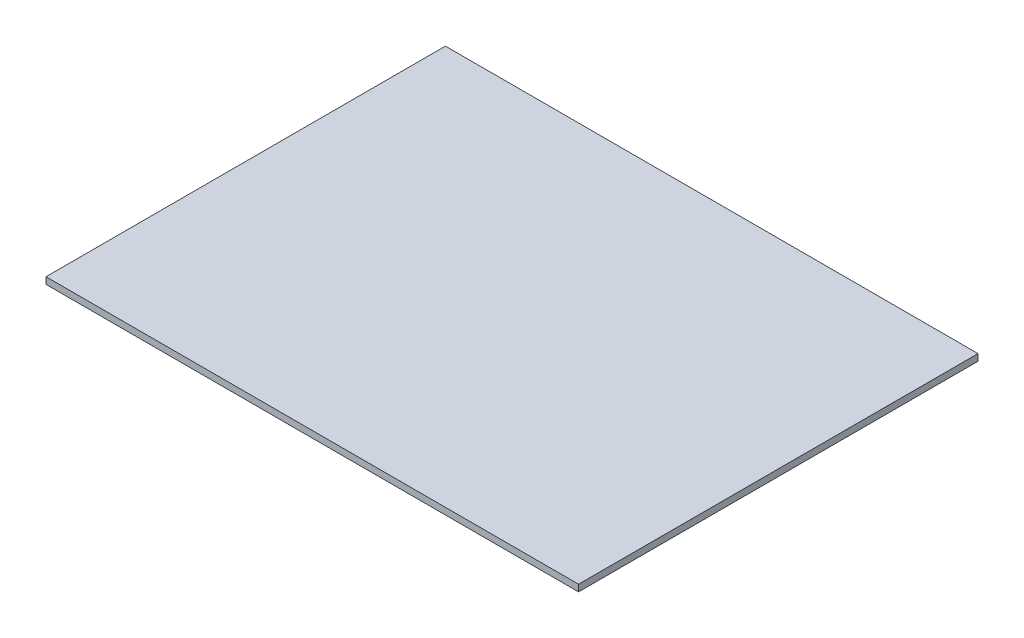
ISO-10303-21;
HEADER;
FILE_DESCRIPTION(('STEP AP214'),'2;1');
FILE_NAME('part.step','',(''),(''),'','','');
FILE_SCHEMA(('AUTOMOTIVE_DESIGN { 1 0 10303 214 1 1 1 1 }'));
ENDSEC;
DATA;
#1=APPLICATION_CONTEXT('core data for automotive mechanical design processes');
#2=APPLICATION_PROTOCOL_DEFINITION('international standard','automotive_design',2000,#1);
#3=PRODUCT_CONTEXT('',#1,'mechanical');
#4=PRODUCT('Part','Part','',(#3));
#5=PRODUCT_RELATED_PRODUCT_CATEGORY('part','',(#4));
#6=PRODUCT_DEFINITION_FORMATION('','',#4);
#7=PRODUCT_DEFINITION_CONTEXT('part definition',#1,'design');
#8=PRODUCT_DEFINITION('design','',#6,#7);
#9=PRODUCT_DEFINITION_SHAPE('','',#8);
#10=(LENGTH_UNIT() NAMED_UNIT(*) SI_UNIT(.MILLI.,.METRE.));
#11=(NAMED_UNIT(*) PLANE_ANGLE_UNIT() SI_UNIT($,.RADIAN.));
#12=(NAMED_UNIT(*) SI_UNIT($,.STERADIAN.) SOLID_ANGLE_UNIT());
#13=UNCERTAINTY_MEASURE_WITH_UNIT(LENGTH_MEASURE(1.E-05),#10,'distance_accuracy_value','');
#14=(GEOMETRIC_REPRESENTATION_CONTEXT(3) GLOBAL_UNCERTAINTY_ASSIGNED_CONTEXT((#13)) GLOBAL_UNIT_ASSIGNED_CONTEXT((#10,
#11,#12)) REPRESENTATION_CONTEXT('',''));
#15=CARTESIAN_POINT('',(0.,0.,0.));
#16=DIRECTION('',(0.,0.,1.));
#17=DIRECTION('',(1.,0.,0.));
#18=AXIS2_PLACEMENT_3D('',#15,#16,#17);
#19=CARTESIAN_POINT('',(127.,3.175,-95.25));
#20=DIRECTION('',(-1.,0.,0.));
#21=DIRECTION('',(0.,0.,1.));
#22=AXIS2_PLACEMENT_3D('',#19,#20,#21);
#23=PLANE('',#22);
#24=DIRECTION('',(0.,0.,-1.));
#25=VECTOR('',#24,1.);
#26=CARTESIAN_POINT('',(127.,0.,-95.25));
#27=LINE('',#26,#25);
#28=CARTESIAN_POINT('',(127.,0.,95.25));
#29=VERTEX_POINT('',#28);
#30=CARTESIAN_POINT('',(127.,0.,-95.25));
#31=VERTEX_POINT('',#30);
#32=EDGE_CURVE('E101',#29,#31,#27,.T.);
#33=ORIENTED_EDGE('',*,*,#32,.T.);
#34=DIRECTION('',(0.,-1.,0.));
#35=VECTOR('',#34,1.);
#36=CARTESIAN_POINT('',(127.,3.175,-95.25));
#37=LINE('',#36,#35);
#38=CARTESIAN_POINT('',(127.,3.175,-95.25));
#39=VERTEX_POINT('',#38);
#40=EDGE_CURVE('E11',#39,#31,#37,.T.);
#41=ORIENTED_EDGE('',*,*,#40,.F.);
#42=DIRECTION('',(0.,0.,-1.));
#43=VECTOR('',#42,1.);
#44=CARTESIAN_POINT('',(127.,3.175,-95.25));
#45=LINE('',#44,#43);
#46=CARTESIAN_POINT('',(127.,3.175,95.25));
#47=VERTEX_POINT('',#46);
#48=EDGE_CURVE('E89',#47,#39,#45,.T.);
#49=ORIENTED_EDGE('',*,*,#48,.F.);
#50=DIRECTION('',(0.,-1.,0.));
#51=VECTOR('',#50,1.);
#52=CARTESIAN_POINT('',(127.,3.175,95.25));
#53=LINE('',#52,#51);
#54=EDGE_CURVE('E97',#47,#29,#53,.T.);
#55=ORIENTED_EDGE('',*,*,#54,.T.);
#56=EDGE_LOOP('',(#33,#41,#49,#55));
#57=FACE_BOUND('',#56,.T.);
#58=ADVANCED_FACE('F38',(#57),#23,.F.);
#59=CARTESIAN_POINT('',(-127.,3.175,-95.25));
#60=DIRECTION('',(0.,0.,1.));
#61=DIRECTION('',(1.,0.,0.));
#62=AXIS2_PLACEMENT_3D('',#59,#60,#61);
#63=PLANE('',#62);
#64=DIRECTION('',(-1.,0.,0.));
#65=VECTOR('',#64,1.);
#66=CARTESIAN_POINT('',(-127.,0.,-95.25));
#67=LINE('',#66,#65);
#68=CARTESIAN_POINT('',(-127.,0.,-95.25));
#69=VERTEX_POINT('',#68);
#70=EDGE_CURVE('E93',#31,#69,#67,.T.);
#71=ORIENTED_EDGE('',*,*,#70,.T.);
#72=DIRECTION('',(0.,-1.,0.));
#73=VECTOR('',#72,1.);
#74=CARTESIAN_POINT('',(-127.,3.175,-95.25));
#75=LINE('',#74,#73);
#76=CARTESIAN_POINT('',(-127.,3.175,-95.25));
#77=VERTEX_POINT('',#76);
#78=EDGE_CURVE('E46',#77,#69,#75,.T.);
#79=ORIENTED_EDGE('',*,*,#78,.F.);
#80=DIRECTION('',(-1.,0.,0.));
#81=VECTOR('',#80,1.);
#82=CARTESIAN_POINT('',(-127.,3.175,-95.25));
#83=LINE('',#82,#81);
#84=EDGE_CURVE('E84',#39,#77,#83,.T.);
#85=ORIENTED_EDGE('',*,*,#84,.F.);
#86=ORIENTED_EDGE('',*,*,#40,.T.);
#87=EDGE_LOOP('',(#71,#79,#85,#86));
#88=FACE_BOUND('',#87,.T.);
#89=ADVANCED_FACE('F92',(#88),#63,.F.);
#90=CARTESIAN_POINT('',(-127.,3.175,-95.25));
#91=DIRECTION('',(1.,0.,0.));
#92=DIRECTION('',(0.,0.,-1.));
#93=AXIS2_PLACEMENT_3D('',#90,#91,#92);
#94=PLANE('',#93);
#95=DIRECTION('',(0.,0.,1.));
#96=VECTOR('',#95,1.);
#97=CARTESIAN_POINT('',(-127.,0.,-95.25));
#98=LINE('',#97,#96);
#99=CARTESIAN_POINT('',(-127.,0.,95.25));
#100=VERTEX_POINT('',#99);
#101=EDGE_CURVE('E71',#69,#100,#98,.T.);
#102=ORIENTED_EDGE('',*,*,#101,.T.);
#103=DIRECTION('',(0.,-1.,0.));
#104=VECTOR('',#103,1.);
#105=CARTESIAN_POINT('',(-127.,3.175,95.25));
#106=LINE('',#105,#104);
#107=CARTESIAN_POINT('',(-127.,3.175,95.25));
#108=VERTEX_POINT('',#107);
#109=EDGE_CURVE('E94',#108,#100,#106,.T.);
#110=ORIENTED_EDGE('',*,*,#109,.F.);
#111=DIRECTION('',(0.,0.,1.));
#112=VECTOR('',#111,1.);
#113=CARTESIAN_POINT('',(-127.,3.175,-95.25));
#114=LINE('',#113,#112);
#115=EDGE_CURVE('E87',#77,#108,#114,.T.);
#116=ORIENTED_EDGE('',*,*,#115,.F.);
#117=ORIENTED_EDGE('',*,*,#78,.T.);
#118=EDGE_LOOP('',(#102,#110,#116,#117));
#119=FACE_BOUND('',#118,.T.);
#120=ADVANCED_FACE('F95',(#119),#94,.F.);
#121=CARTESIAN_POINT('',(-127.,3.175,95.25));
#122=DIRECTION('',(0.,0.,-1.));
#123=DIRECTION('',(-1.,0.,0.));
#124=AXIS2_PLACEMENT_3D('',#121,#122,#123);
#125=PLANE('',#124);
#126=DIRECTION('',(1.,0.,0.));
#127=VECTOR('',#126,1.);
#128=CARTESIAN_POINT('',(-127.,0.,95.25));
#129=LINE('',#128,#127);
#130=EDGE_CURVE('E77',#100,#29,#129,.T.);
#131=ORIENTED_EDGE('',*,*,#130,.T.);
#132=ORIENTED_EDGE('',*,*,#54,.F.);
#133=DIRECTION('',(1.,0.,0.));
#134=VECTOR('',#133,1.);
#135=CARTESIAN_POINT('',(-127.,3.175,95.25));
#136=LINE('',#135,#134);
#137=EDGE_CURVE('E54',#108,#47,#136,.T.);
#138=ORIENTED_EDGE('',*,*,#137,.F.);
#139=ORIENTED_EDGE('',*,*,#109,.T.);
#140=EDGE_LOOP('',(#131,#132,#138,#139));
#141=FACE_BOUND('',#140,.T.);
#142=ADVANCED_FACE('F108',(#141),#125,.F.);
#143=CARTESIAN_POINT('',(0.,3.175,0.));
#144=DIRECTION('',(0.,1.,0.));
#145=DIRECTION('',(0.,0.,1.));
#146=AXIS2_PLACEMENT_3D('',#143,#144,#145);
#147=PLANE('',#146);
#148=ORIENTED_EDGE('',*,*,#48,.T.);
#149=ORIENTED_EDGE('',*,*,#84,.T.);
#150=ORIENTED_EDGE('',*,*,#115,.T.);
#151=ORIENTED_EDGE('',*,*,#137,.T.);
#152=EDGE_LOOP('',(#148,#149,#150,#151));
#153=FACE_BOUND('',#152,.T.);
#154=ADVANCED_FACE('F85',(#153),#147,.T.);
#155=CARTESIAN_POINT('',(0.,0.,0.));
#156=DIRECTION('',(0.,1.,0.));
#157=DIRECTION('',(0.,0.,1.));
#158=AXIS2_PLACEMENT_3D('',#155,#156,#157);
#159=PLANE('',#158);
#160=ORIENTED_EDGE('',*,*,#32,.F.);
#161=ORIENTED_EDGE('',*,*,#130,.F.);
#162=ORIENTED_EDGE('',*,*,#101,.F.);
#163=ORIENTED_EDGE('',*,*,#70,.F.);
#164=EDGE_LOOP('',(#160,#161,#162,#163));
#165=FACE_BOUND('',#164,.T.);
#166=ADVANCED_FACE('F111',(#165),#159,.F.);
#167=CLOSED_SHELL('',(#58,#89,#120,#142,#154,#166));
#168=MANIFOLD_SOLID_BREP('B2',#167);
#169=ADVANCED_BREP_SHAPE_REPRESENTATION('',(#18,#168),#14);
#170=SHAPE_DEFINITION_REPRESENTATION(#9,#169);
ENDSEC;
END-ISO-10303-21;
